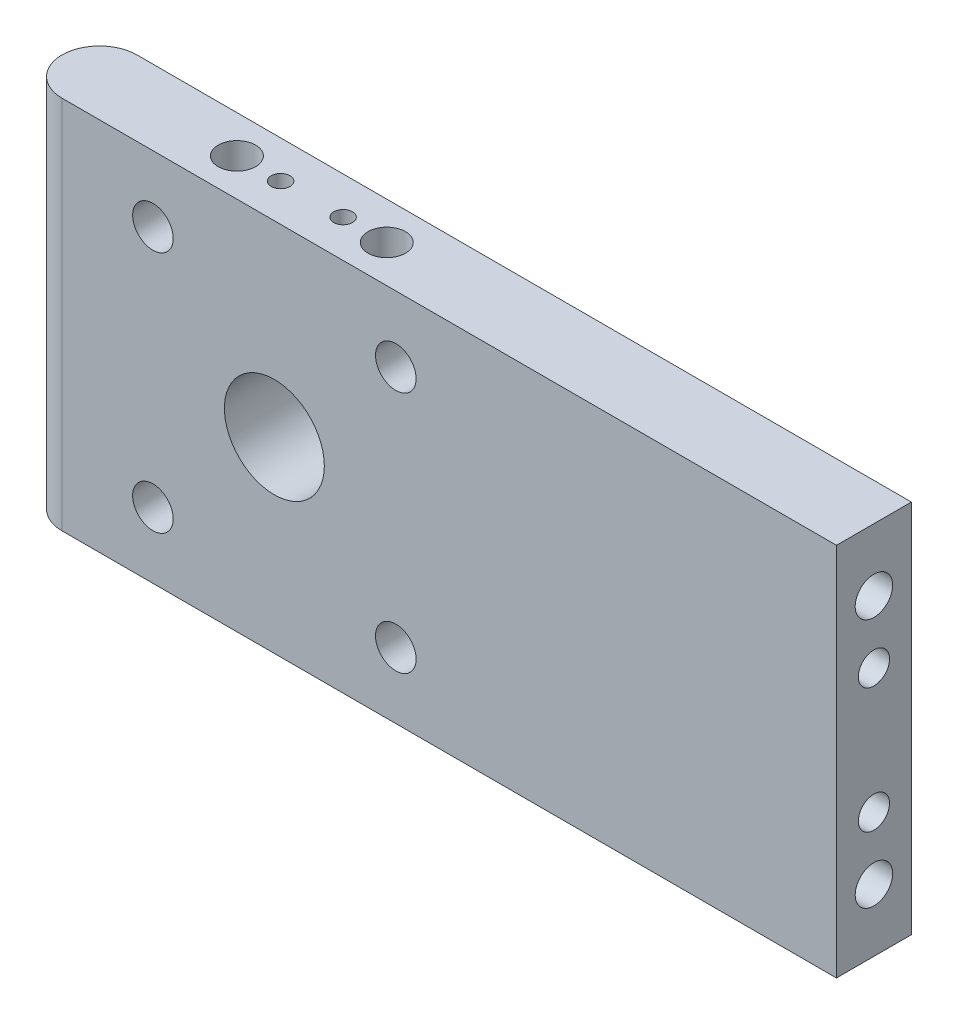
ISO-10303-21;
HEADER;
FILE_DESCRIPTION(('STEP AP214'),'2;1');
FILE_NAME('part.step','',(''),(''),'','','');
FILE_SCHEMA(('AUTOMOTIVE_DESIGN { 1 0 10303 214 1 1 1 1 }'));
ENDSEC;
DATA;
#1=APPLICATION_CONTEXT('core data for automotive mechanical design processes');
#2=APPLICATION_PROTOCOL_DEFINITION('international standard','automotive_design',2000,#1);
#3=PRODUCT_CONTEXT('',#1,'mechanical');
#4=PRODUCT('Part','Part','',(#3));
#5=PRODUCT_RELATED_PRODUCT_CATEGORY('part','',(#4));
#6=PRODUCT_DEFINITION_FORMATION('','',#4);
#7=PRODUCT_DEFINITION_CONTEXT('part definition',#1,'design');
#8=PRODUCT_DEFINITION('design','',#6,#7);
#9=PRODUCT_DEFINITION_SHAPE('','',#8);
#10=(LENGTH_UNIT() NAMED_UNIT(*) SI_UNIT(.MILLI.,.METRE.));
#11=(NAMED_UNIT(*) PLANE_ANGLE_UNIT() SI_UNIT($,.RADIAN.));
#12=(NAMED_UNIT(*) SI_UNIT($,.STERADIAN.) SOLID_ANGLE_UNIT());
#13=UNCERTAINTY_MEASURE_WITH_UNIT(LENGTH_MEASURE(1.E-05),#10,'distance_accuracy_value','');
#14=(GEOMETRIC_REPRESENTATION_CONTEXT(3) GLOBAL_UNCERTAINTY_ASSIGNED_CONTEXT((#13)) GLOBAL_UNIT_ASSIGNED_CONTEXT((#10,
#11,#12)) REPRESENTATION_CONTEXT('',''));
#15=CARTESIAN_POINT('',(0.,0.,0.));
#16=DIRECTION('',(0.,0.,1.));
#17=DIRECTION('',(1.,0.,0.));
#18=AXIS2_PLACEMENT_3D('',#15,#16,#17);
#19=CARTESIAN_POINT('',(0.,0.,12.));
#20=DIRECTION('',(0.,0.,-1.));
#21=DIRECTION('',(-1.,0.,0.));
#22=AXIS2_PLACEMENT_3D('',#19,#20,#21);
#23=PLANE('',#22);
#24=DIRECTION('',(-1.,0.,0.));
#25=VECTOR('',#24,1.);
#26=CARTESIAN_POINT('',(-65.,30.,12.));
#27=LINE('',#26,#25);
#28=CARTESIAN_POINT('',(65.,30.,12.));
#29=VERTEX_POINT('',#28);
#30=CARTESIAN_POINT('',(-59.,30.,12.));
#31=VERTEX_POINT('',#30);
#32=EDGE_CURVE('E75',#29,#31,#27,.T.);
#33=ORIENTED_EDGE('',*,*,#32,.T.);
#34=DIRECTION('',(0.,-1.,0.));
#35=VECTOR('',#34,1.);
#36=CARTESIAN_POINT('',(-59.,0.,12.));
#37=LINE('',#36,#35);
#38=CARTESIAN_POINT('',(-59.,-30.,12.));
#39=VERTEX_POINT('',#38);
#40=EDGE_CURVE('E11',#31,#39,#37,.T.);
#41=ORIENTED_EDGE('',*,*,#40,.T.);
#42=DIRECTION('',(1.,0.,0.));
#43=VECTOR('',#42,1.);
#44=CARTESIAN_POINT('',(-65.,-30.,12.));
#45=LINE('',#44,#43);
#46=CARTESIAN_POINT('',(65.,-30.,12.));
#47=VERTEX_POINT('',#46);
#48=EDGE_CURVE('E83',#39,#47,#45,.T.);
#49=ORIENTED_EDGE('',*,*,#48,.T.);
#50=DIRECTION('',(0.,1.,0.));
#51=VECTOR('',#50,1.);
#52=CARTESIAN_POINT('',(65.,-30.,12.));
#53=LINE('',#52,#51);
#54=EDGE_CURVE('E84',#47,#29,#53,.T.);
#55=ORIENTED_EDGE('',*,*,#54,.T.);
#56=EDGE_LOOP('',(#33,#41,#49,#55));
#57=FACE_BOUND('',#56,.T.);
#58=CARTESIAN_POINT('',(-25.,0.,12.));
#59=DIRECTION('',(0.,0.,1.));
#60=DIRECTION('',(1.,0.,0.));
#61=AXIS2_PLACEMENT_3D('',#58,#59,#60);
#62=CIRCLE('',#61,8.);
#63=CARTESIAN_POINT('',(-17.,0.,12.));
#64=VERTEX_POINT('',#63);
#65=EDGE_CURVE('E119',#64,#64,#62,.T.);
#66=ORIENTED_EDGE('',*,*,#65,.F.);
#67=EDGE_LOOP('',(#66));
#68=FACE_BOUND('',#67,.T.);
#69=CARTESIAN_POINT('',(-5.55456351736992,19.44543648263,12.));
#70=DIRECTION('',(0.,0.,1.));
#71=DIRECTION('',(1.,0.,0.));
#72=AXIS2_PLACEMENT_3D('',#69,#70,#71);
#73=CIRCLE('',#72,3.25);
#74=CARTESIAN_POINT('',(-2.30456351736992,19.44543648263,12.));
#75=VERTEX_POINT('',#74);
#76=EDGE_CURVE('E126',#75,#75,#73,.T.);
#77=ORIENTED_EDGE('',*,*,#76,.F.);
#78=EDGE_LOOP('',(#77));
#79=FACE_BOUND('',#78,.T.);
#80=CARTESIAN_POINT('',(-44.4454364826302,19.44543648263,12.));
#81=DIRECTION('',(0.,0.,1.));
#82=DIRECTION('',(1.,0.,0.));
#83=AXIS2_PLACEMENT_3D('',#80,#81,#82);
#84=CIRCLE('',#83,3.25);
#85=CARTESIAN_POINT('',(-41.1954364826302,19.44543648263,12.));
#86=VERTEX_POINT('',#85);
#87=EDGE_CURVE('E132',#86,#86,#84,.T.);
#88=ORIENTED_EDGE('',*,*,#87,.F.);
#89=EDGE_LOOP('',(#88));
#90=FACE_BOUND('',#89,.T.);
#91=CARTESIAN_POINT('',(-44.4454364826302,-19.4454364826299,12.));
#92=DIRECTION('',(0.,0.,1.));
#93=DIRECTION('',(-1.,0.,0.));
#94=AXIS2_PLACEMENT_3D('',#91,#92,#93);
#95=CIRCLE('',#94,3.25);
#96=CARTESIAN_POINT('',(-47.6954364826302,-19.4454364826299,12.));
#97=VERTEX_POINT('',#96);
#98=EDGE_CURVE('E138',#97,#97,#95,.T.);
#99=ORIENTED_EDGE('',*,*,#98,.F.);
#100=EDGE_LOOP('',(#99));
#101=FACE_BOUND('',#100,.T.);
#102=CARTESIAN_POINT('',(-5.55456351736992,-19.44543648263,12.));
#103=DIRECTION('',(0.,0.,1.));
#104=DIRECTION('',(-1.,0.,0.));
#105=AXIS2_PLACEMENT_3D('',#102,#103,#104);
#106=CIRCLE('',#105,3.25);
#107=CARTESIAN_POINT('',(-8.80456351736992,-19.44543648263,12.));
#108=VERTEX_POINT('',#107);
#109=EDGE_CURVE('E144',#108,#108,#106,.T.);
#110=ORIENTED_EDGE('',*,*,#109,.F.);
#111=EDGE_LOOP('',(#110));
#112=FACE_BOUND('',#111,.T.);
#113=ADVANCED_FACE('F33',(#57,#68,#79,#90,#101,#112),#23,.F.);
#114=CARTESIAN_POINT('',(0.,0.,0.));
#115=DIRECTION('',(0.,0.,-1.));
#116=DIRECTION('',(-1.,0.,0.));
#117=AXIS2_PLACEMENT_3D('',#114,#115,#116);
#118=PLANE('',#117);
#119=CARTESIAN_POINT('',(-44.4454364826302,-19.4454364826299,0.));
#120=DIRECTION('',(0.,0.,1.));
#121=DIRECTION('',(-1.,0.,0.));
#122=AXIS2_PLACEMENT_3D('',#119,#120,#121);
#123=CIRCLE('',#122,3.25);
#124=CARTESIAN_POINT('',(-47.6954364826302,-19.4454364826299,0.));
#125=VERTEX_POINT('',#124);
#126=EDGE_CURVE('E141',#125,#125,#123,.T.);
#127=ORIENTED_EDGE('',*,*,#126,.T.);
#128=EDGE_LOOP('',(#127));
#129=FACE_BOUND('',#128,.T.);
#130=CARTESIAN_POINT('',(-5.55456351736992,19.44543648263,0.));
#131=DIRECTION('',(0.,0.,1.));
#132=DIRECTION('',(1.,0.,0.));
#133=AXIS2_PLACEMENT_3D('',#130,#131,#132);
#134=CIRCLE('',#133,3.25);
#135=CARTESIAN_POINT('',(-2.30456351736992,19.44543648263,0.));
#136=VERTEX_POINT('',#135);
#137=EDGE_CURVE('E129',#136,#136,#134,.T.);
#138=ORIENTED_EDGE('',*,*,#137,.T.);
#139=EDGE_LOOP('',(#138));
#140=FACE_BOUND('',#139,.T.);
#141=DIRECTION('',(1.,0.,0.));
#142=VECTOR('',#141,1.);
#143=CARTESIAN_POINT('',(-65.,-30.,0.));
#144=LINE('',#143,#142);
#145=CARTESIAN_POINT('',(-59.,-30.,0.));
#146=VERTEX_POINT('',#145);
#147=CARTESIAN_POINT('',(65.,-30.,0.));
#148=VERTEX_POINT('',#147);
#149=EDGE_CURVE('E92',#146,#148,#144,.T.);
#150=ORIENTED_EDGE('',*,*,#149,.F.);
#151=DIRECTION('',(0.,-1.,0.));
#152=VECTOR('',#151,1.);
#153=CARTESIAN_POINT('',(-59.,30.,0.));
#154=LINE('',#153,#152);
#155=CARTESIAN_POINT('',(-59.,30.,0.));
#156=VERTEX_POINT('',#155);
#157=EDGE_CURVE('E106',#146,#156,#154,.F.);
#158=ORIENTED_EDGE('',*,*,#157,.T.);
#159=DIRECTION('',(-1.,0.,0.));
#160=VECTOR('',#159,1.);
#161=CARTESIAN_POINT('',(-65.,30.,0.));
#162=LINE('',#161,#160);
#163=CARTESIAN_POINT('',(65.,30.,0.));
#164=VERTEX_POINT('',#163);
#165=EDGE_CURVE('E115',#164,#156,#162,.T.);
#166=ORIENTED_EDGE('',*,*,#165,.F.);
#167=DIRECTION('',(0.,1.,0.));
#168=VECTOR('',#167,1.);
#169=CARTESIAN_POINT('',(65.,-30.,0.));
#170=LINE('',#169,#168);
#171=EDGE_CURVE('E96',#148,#164,#170,.T.);
#172=ORIENTED_EDGE('',*,*,#171,.F.);
#173=EDGE_LOOP('',(#150,#158,#166,#172));
#174=FACE_BOUND('',#173,.T.);
#175=CARTESIAN_POINT('',(-25.,0.,0.));
#176=DIRECTION('',(0.,0.,1.));
#177=DIRECTION('',(1.,0.,0.));
#178=AXIS2_PLACEMENT_3D('',#175,#176,#177);
#179=CIRCLE('',#178,8.);
#180=CARTESIAN_POINT('',(-17.,0.,0.));
#181=VERTEX_POINT('',#180);
#182=EDGE_CURVE('E123',#181,#181,#179,.T.);
#183=ORIENTED_EDGE('',*,*,#182,.T.);
#184=EDGE_LOOP('',(#183));
#185=FACE_BOUND('',#184,.T.);
#186=CARTESIAN_POINT('',(-44.4454364826302,19.44543648263,0.));
#187=DIRECTION('',(0.,0.,1.));
#188=DIRECTION('',(1.,0.,0.));
#189=AXIS2_PLACEMENT_3D('',#186,#187,#188);
#190=CIRCLE('',#189,3.25);
#191=CARTESIAN_POINT('',(-41.1954364826302,19.44543648263,0.));
#192=VERTEX_POINT('',#191);
#193=EDGE_CURVE('E135',#192,#192,#190,.T.);
#194=ORIENTED_EDGE('',*,*,#193,.T.);
#195=EDGE_LOOP('',(#194));
#196=FACE_BOUND('',#195,.T.);
#197=CARTESIAN_POINT('',(-5.55456351736992,-19.44543648263,0.));
#198=DIRECTION('',(0.,0.,1.));
#199=DIRECTION('',(-1.,0.,0.));
#200=AXIS2_PLACEMENT_3D('',#197,#198,#199);
#201=CIRCLE('',#200,3.25);
#202=CARTESIAN_POINT('',(-8.80456351736992,-19.44543648263,0.));
#203=VERTEX_POINT('',#202);
#204=EDGE_CURVE('E147',#203,#203,#201,.T.);
#205=ORIENTED_EDGE('',*,*,#204,.T.);
#206=EDGE_LOOP('',(#205));
#207=FACE_BOUND('',#206,.T.);
#208=ADVANCED_FACE('F113',(#129,#140,#174,#185,#196,#207),#118,.T.);
#209=CARTESIAN_POINT('',(65.,-30.,12.));
#210=DIRECTION('',(-1.,0.,0.));
#211=DIRECTION('',(0.,0.,1.));
#212=AXIS2_PLACEMENT_3D('',#209,#210,#211);
#213=PLANE('',#212);
#214=CARTESIAN_POINT('',(65.,20.,6.));
#215=DIRECTION('',(1.,0.,0.));
#216=DIRECTION('',(0.,0.,-1.));
#217=AXIS2_PLACEMENT_3D('',#214,#215,#216);
#218=CIRCLE('',#217,3.);
#219=CARTESIAN_POINT('',(65.,20.,3.));
#220=VERTEX_POINT('',#219);
#221=EDGE_CURVE('E171',#220,#220,#218,.T.);
#222=ORIENTED_EDGE('',*,*,#221,.F.);
#223=EDGE_LOOP('',(#222));
#224=FACE_BOUND('',#223,.T.);
#225=CARTESIAN_POINT('',(65.,10.,6.));
#226=DIRECTION('',(1.,0.,0.));
#227=DIRECTION('',(0.,0.,-1.));
#228=AXIS2_PLACEMENT_3D('',#225,#226,#227);
#229=CIRCLE('',#228,2.5);
#230=CARTESIAN_POINT('',(65.,10.,3.5));
#231=VERTEX_POINT('',#230);
#232=EDGE_CURVE('E165',#231,#231,#229,.T.);
#233=ORIENTED_EDGE('',*,*,#232,.F.);
#234=EDGE_LOOP('',(#233));
#235=FACE_BOUND('',#234,.T.);
#236=CARTESIAN_POINT('',(65.,-10.,6.));
#237=DIRECTION('',(1.,0.,0.));
#238=DIRECTION('',(0.,0.,1.));
#239=AXIS2_PLACEMENT_3D('',#236,#237,#238);
#240=CIRCLE('',#239,2.5);
#241=CARTESIAN_POINT('',(65.,-10.,8.5));
#242=VERTEX_POINT('',#241);
#243=EDGE_CURVE('E159',#242,#242,#240,.T.);
#244=ORIENTED_EDGE('',*,*,#243,.F.);
#245=EDGE_LOOP('',(#244));
#246=FACE_BOUND('',#245,.T.);
#247=CARTESIAN_POINT('',(65.,-20.,6.));
#248=DIRECTION('',(1.,0.,0.));
#249=DIRECTION('',(0.,0.,1.));
#250=AXIS2_PLACEMENT_3D('',#247,#248,#249);
#251=CIRCLE('',#250,3.);
#252=CARTESIAN_POINT('',(65.,-20.,9.));
#253=VERTEX_POINT('',#252);
#254=EDGE_CURVE('E152',#253,#253,#251,.T.);
#255=ORIENTED_EDGE('',*,*,#254,.F.);
#256=EDGE_LOOP('',(#255));
#257=FACE_BOUND('',#256,.T.);
#258=ORIENTED_EDGE('',*,*,#171,.T.);
#259=DIRECTION('',(0.,0.,-1.));
#260=VECTOR('',#259,1.);
#261=CARTESIAN_POINT('',(65.,30.,12.));
#262=LINE('',#261,#260);
#263=EDGE_CURVE('E79',#29,#164,#262,.T.);
#264=ORIENTED_EDGE('',*,*,#263,.F.);
#265=ORIENTED_EDGE('',*,*,#54,.F.);
#266=DIRECTION('',(0.,0.,-1.));
#267=VECTOR('',#266,1.);
#268=CARTESIAN_POINT('',(65.,-30.,12.));
#269=LINE('',#268,#267);
#270=EDGE_CURVE('E98',#47,#148,#269,.T.);
#271=ORIENTED_EDGE('',*,*,#270,.T.);
#272=EDGE_LOOP('',(#258,#264,#265,#271));
#273=FACE_BOUND('',#272,.T.);
#274=ADVANCED_FACE('F94',(#224,#235,#246,#257,#273),#213,.F.);
#275=CARTESIAN_POINT('',(-65.,30.,12.));
#276=DIRECTION('',(0.,-1.,0.));
#277=DIRECTION('',(0.,0.,-1.));
#278=AXIS2_PLACEMENT_3D('',#275,#276,#277);
#279=PLANE('',#278);
#280=CARTESIAN_POINT('',(-13.,30.,6.));
#281=DIRECTION('',(0.,1.,0.));
#282=DIRECTION('',(0.,0.,1.));
#283=AXIS2_PLACEMENT_3D('',#280,#281,#282);
#284=CIRCLE('',#283,3.);
#285=CARTESIAN_POINT('',(-13.,30.,9.));
#286=VERTEX_POINT('',#285);
#287=EDGE_CURVE('E195',#286,#286,#284,.T.);
#288=ORIENTED_EDGE('',*,*,#287,.F.);
#289=EDGE_LOOP('',(#288));
#290=FACE_BOUND('',#289,.T.);
#291=CARTESIAN_POINT('',(-20.,30.,6.));
#292=DIRECTION('',(0.,1.,0.));
#293=DIRECTION('',(0.,0.,1.));
#294=AXIS2_PLACEMENT_3D('',#291,#292,#293);
#295=CIRCLE('',#294,1.5);
#296=CARTESIAN_POINT('',(-20.,30.,7.5));
#297=VERTEX_POINT('',#296);
#298=EDGE_CURVE('E189',#297,#297,#295,.T.);
#299=ORIENTED_EDGE('',*,*,#298,.F.);
#300=EDGE_LOOP('',(#299));
#301=FACE_BOUND('',#300,.T.);
#302=CARTESIAN_POINT('',(-30.,30.,6.));
#303=DIRECTION('',(0.,1.,0.));
#304=DIRECTION('',(0.,0.,-1.));
#305=AXIS2_PLACEMENT_3D('',#302,#303,#304);
#306=CIRCLE('',#305,1.5);
#307=CARTESIAN_POINT('',(-30.,30.,4.5));
#308=VERTEX_POINT('',#307);
#309=EDGE_CURVE('E183',#308,#308,#306,.T.);
#310=ORIENTED_EDGE('',*,*,#309,.F.);
#311=EDGE_LOOP('',(#310));
#312=FACE_BOUND('',#311,.T.);
#313=CARTESIAN_POINT('',(-37.,30.,6.));
#314=DIRECTION('',(0.,1.,0.));
#315=DIRECTION('',(0.,0.,-1.));
#316=AXIS2_PLACEMENT_3D('',#313,#314,#315);
#317=CIRCLE('',#316,3.);
#318=CARTESIAN_POINT('',(-37.,30.,3.));
#319=VERTEX_POINT('',#318);
#320=EDGE_CURVE('E177',#319,#319,#317,.T.);
#321=ORIENTED_EDGE('',*,*,#320,.F.);
#322=EDGE_LOOP('',(#321));
#323=FACE_BOUND('',#322,.T.);
#324=ORIENTED_EDGE('',*,*,#165,.T.);
#325=CARTESIAN_POINT('',(-59.,30.,6.));
#326=DIRECTION('',(0.,-1.,0.));
#327=DIRECTION('',(0.,0.,-1.));
#328=AXIS2_PLACEMENT_3D('',#325,#326,#327);
#329=CIRCLE('',#328,6.);
#330=CARTESIAN_POINT('',(-65.,30.,6.));
#331=VERTEX_POINT('',#330);
#332=EDGE_CURVE('E42',#156,#331,#329,.F.);
#333=ORIENTED_EDGE('',*,*,#332,.T.);
#334=CARTESIAN_POINT('',(-59.,30.,6.));
#335=DIRECTION('',(0.,-1.,0.));
#336=DIRECTION('',(0.,0.,-1.));
#337=AXIS2_PLACEMENT_3D('',#334,#335,#336);
#338=CIRCLE('',#337,6.);
#339=EDGE_CURVE('E49',#331,#31,#338,.F.);
#340=ORIENTED_EDGE('',*,*,#339,.T.);
#341=ORIENTED_EDGE('',*,*,#32,.F.);
#342=ORIENTED_EDGE('',*,*,#263,.T.);
#343=EDGE_LOOP('',(#324,#333,#340,#341,#342));
#344=FACE_BOUND('',#343,.T.);
#345=ADVANCED_FACE('F77',(#290,#301,#312,#323,#344),#279,.F.);
#346=CARTESIAN_POINT('',(-65.,-30.,12.));
#347=DIRECTION('',(0.,1.,0.));
#348=DIRECTION('',(0.,0.,1.));
#349=AXIS2_PLACEMENT_3D('',#346,#347,#348);
#350=PLANE('',#349);
#351=CARTESIAN_POINT('',(-59.,-30.,6.));
#352=DIRECTION('',(0.,1.,0.));
#353=DIRECTION('',(0.,0.,1.));
#354=AXIS2_PLACEMENT_3D('',#351,#352,#353);
#355=CIRCLE('',#354,6.);
#356=CARTESIAN_POINT('',(-65.,-30.,6.));
#357=VERTEX_POINT('',#356);
#358=EDGE_CURVE('E97',#39,#357,#355,.F.);
#359=ORIENTED_EDGE('',*,*,#358,.T.);
#360=CARTESIAN_POINT('',(-59.,-30.,6.));
#361=DIRECTION('',(0.,1.,0.));
#362=DIRECTION('',(0.,0.,1.));
#363=AXIS2_PLACEMENT_3D('',#360,#361,#362);
#364=CIRCLE('',#363,6.);
#365=EDGE_CURVE('E100',#357,#146,#364,.F.);
#366=ORIENTED_EDGE('',*,*,#365,.T.);
#367=ORIENTED_EDGE('',*,*,#149,.T.);
#368=ORIENTED_EDGE('',*,*,#270,.F.);
#369=ORIENTED_EDGE('',*,*,#48,.F.);
#370=EDGE_LOOP('',(#359,#366,#367,#368,#369));
#371=FACE_BOUND('',#370,.T.);
#372=ADVANCED_FACE('F212',(#371),#350,.F.);
#373=CARTESIAN_POINT('',(-25.,0.,12.));
#374=DIRECTION('',(0.,0.,-1.));
#375=DIRECTION('',(-1.,0.,0.));
#376=AXIS2_PLACEMENT_3D('',#373,#374,#375);
#377=CYLINDRICAL_SURFACE('',#376,8.);
#378=ORIENTED_EDGE('',*,*,#65,.T.);
#379=EDGE_LOOP('',(#378));
#380=FACE_BOUND('',#379,.T.);
#381=ORIENTED_EDGE('',*,*,#182,.F.);
#382=EDGE_LOOP('',(#381));
#383=FACE_BOUND('',#382,.T.);
#384=ADVANCED_FACE('F245',(#380,#383),#377,.F.);
#385=CARTESIAN_POINT('',(-5.55456351736992,19.44543648263,12.));
#386=DIRECTION('',(0.,0.,-1.));
#387=DIRECTION('',(-1.,0.,0.));
#388=AXIS2_PLACEMENT_3D('',#385,#386,#387);
#389=CYLINDRICAL_SURFACE('',#388,3.25);
#390=ORIENTED_EDGE('',*,*,#76,.T.);
#391=EDGE_LOOP('',(#390));
#392=FACE_BOUND('',#391,.T.);
#393=ORIENTED_EDGE('',*,*,#137,.F.);
#394=EDGE_LOOP('',(#393));
#395=FACE_BOUND('',#394,.T.);
#396=ADVANCED_FACE('F284',(#392,#395),#389,.F.);
#397=CARTESIAN_POINT('',(-44.4454364826302,19.44543648263,12.));
#398=DIRECTION('',(0.,0.,-1.));
#399=DIRECTION('',(-1.,0.,0.));
#400=AXIS2_PLACEMENT_3D('',#397,#398,#399);
#401=CYLINDRICAL_SURFACE('',#400,3.25);
#402=ORIENTED_EDGE('',*,*,#87,.T.);
#403=EDGE_LOOP('',(#402));
#404=FACE_BOUND('',#403,.T.);
#405=ORIENTED_EDGE('',*,*,#193,.F.);
#406=EDGE_LOOP('',(#405));
#407=FACE_BOUND('',#406,.T.);
#408=ADVANCED_FACE('F277',(#404,#407),#401,.F.);
#409=CARTESIAN_POINT('',(-44.4454364826302,-19.4454364826299,12.));
#410=DIRECTION('',(0.,0.,-1.));
#411=DIRECTION('',(-1.,0.,0.));
#412=AXIS2_PLACEMENT_3D('',#409,#410,#411);
#413=CYLINDRICAL_SURFACE('',#412,3.25);
#414=ORIENTED_EDGE('',*,*,#98,.T.);
#415=EDGE_LOOP('',(#414));
#416=FACE_BOUND('',#415,.T.);
#417=ORIENTED_EDGE('',*,*,#126,.F.);
#418=EDGE_LOOP('',(#417));
#419=FACE_BOUND('',#418,.T.);
#420=ADVANCED_FACE('F271',(#416,#419),#413,.F.);
#421=CARTESIAN_POINT('',(-5.55456351736992,-19.44543648263,12.));
#422=DIRECTION('',(0.,0.,-1.));
#423=DIRECTION('',(-1.,0.,0.));
#424=AXIS2_PLACEMENT_3D('',#421,#422,#423);
#425=CYLINDRICAL_SURFACE('',#424,3.25);
#426=ORIENTED_EDGE('',*,*,#109,.T.);
#427=EDGE_LOOP('',(#426));
#428=FACE_BOUND('',#427,.T.);
#429=ORIENTED_EDGE('',*,*,#204,.F.);
#430=EDGE_LOOP('',(#429));
#431=FACE_BOUND('',#430,.T.);
#432=ADVANCED_FACE('F263',(#428,#431),#425,.F.);
#433=CARTESIAN_POINT('',(-59.,0.,6.));
#434=DIRECTION('',(0.,-1.,0.));
#435=DIRECTION('',(0.,0.,-1.));
#436=AXIS2_PLACEMENT_3D('',#433,#434,#435);
#437=CYLINDRICAL_SURFACE('',#436,6.);
#438=ORIENTED_EDGE('',*,*,#40,.F.);
#439=ORIENTED_EDGE('',*,*,#339,.F.);
#440=DIRECTION('',(0.,-1.,0.));
#441=VECTOR('',#440,1.);
#442=CARTESIAN_POINT('',(-65.,-30.,6.));
#443=LINE('',#442,#441);
#444=EDGE_CURVE('E37',#357,#331,#443,.F.);
#445=ORIENTED_EDGE('',*,*,#444,.F.);
#446=ORIENTED_EDGE('',*,*,#358,.F.);
#447=EDGE_LOOP('',(#438,#439,#445,#446));
#448=FACE_BOUND('',#447,.T.);
#449=ADVANCED_FACE('F35',(#448),#437,.T.);
#450=CARTESIAN_POINT('',(-59.,-30.,6.));
#451=DIRECTION('',(0.,1.,0.));
#452=DIRECTION('',(0.,0.,1.));
#453=AXIS2_PLACEMENT_3D('',#450,#451,#452);
#454=CYLINDRICAL_SURFACE('',#453,6.);
#455=ORIENTED_EDGE('',*,*,#332,.F.);
#456=ORIENTED_EDGE('',*,*,#157,.F.);
#457=ORIENTED_EDGE('',*,*,#365,.F.);
#458=ORIENTED_EDGE('',*,*,#444,.T.);
#459=EDGE_LOOP('',(#455,#456,#457,#458));
#460=FACE_BOUND('',#459,.T.);
#461=ADVANCED_FACE('F253',(#460),#454,.T.);
#462=CARTESIAN_POINT('',(45.,-20.,6.));
#463=DIRECTION('',(1.,0.,0.));
#464=DIRECTION('',(0.,0.,-1.));
#465=AXIS2_PLACEMENT_3D('',#462,#463,#464);
#466=CYLINDRICAL_SURFACE('',#465,3.);
#467=CARTESIAN_POINT('',(45.,-20.,6.));
#468=DIRECTION('',(1.,0.,0.));
#469=DIRECTION('',(0.,0.,1.));
#470=AXIS2_PLACEMENT_3D('',#467,#468,#469);
#471=CIRCLE('',#470,3.);
#472=CARTESIAN_POINT('',(45.,-20.,9.));
#473=VERTEX_POINT('',#472);
#474=EDGE_CURVE('E155',#473,#473,#471,.T.);
#475=ORIENTED_EDGE('',*,*,#474,.F.);
#476=EDGE_LOOP('',(#475));
#477=FACE_BOUND('',#476,.T.);
#478=ORIENTED_EDGE('',*,*,#254,.T.);
#479=EDGE_LOOP('',(#478));
#480=FACE_BOUND('',#479,.T.);
#481=ADVANCED_FACE('F255',(#477,#480),#466,.F.);
#482=CARTESIAN_POINT('',(45.,-20.,6.));
#483=DIRECTION('',(-1.,0.,0.));
#484=DIRECTION('',(0.,0.,1.));
#485=AXIS2_PLACEMENT_3D('',#482,#483,#484);
#486=PLANE('',#485);
#487=ORIENTED_EDGE('',*,*,#474,.T.);
#488=EDGE_LOOP('',(#487));
#489=FACE_BOUND('',#488,.T.);
#490=ADVANCED_FACE('F260',(#489),#486,.F.);
#491=CARTESIAN_POINT('',(45.,-10.,6.));
#492=DIRECTION('',(1.,0.,0.));
#493=DIRECTION('',(0.,0.,-1.));
#494=AXIS2_PLACEMENT_3D('',#491,#492,#493);
#495=CYLINDRICAL_SURFACE('',#494,2.5);
#496=CARTESIAN_POINT('',(45.,-10.,6.));
#497=DIRECTION('',(1.,0.,0.));
#498=DIRECTION('',(0.,0.,1.));
#499=AXIS2_PLACEMENT_3D('',#496,#497,#498);
#500=CIRCLE('',#499,2.5);
#501=CARTESIAN_POINT('',(45.,-10.,8.5));
#502=VERTEX_POINT('',#501);
#503=EDGE_CURVE('E162',#502,#502,#500,.T.);
#504=ORIENTED_EDGE('',*,*,#503,.F.);
#505=EDGE_LOOP('',(#504));
#506=FACE_BOUND('',#505,.T.);
#507=ORIENTED_EDGE('',*,*,#243,.T.);
#508=EDGE_LOOP('',(#507));
#509=FACE_BOUND('',#508,.T.);
#510=ADVANCED_FACE('F387',(#506,#509),#495,.F.);
#511=CARTESIAN_POINT('',(45.,-10.,6.));
#512=DIRECTION('',(-1.,0.,0.));
#513=DIRECTION('',(0.,0.,1.));
#514=AXIS2_PLACEMENT_3D('',#511,#512,#513);
#515=PLANE('',#514);
#516=ORIENTED_EDGE('',*,*,#503,.T.);
#517=EDGE_LOOP('',(#516));
#518=FACE_BOUND('',#517,.T.);
#519=ADVANCED_FACE('F395',(#518),#515,.F.);
#520=CARTESIAN_POINT('',(45.,10.,6.));
#521=DIRECTION('',(1.,0.,0.));
#522=DIRECTION('',(0.,0.,-1.));
#523=AXIS2_PLACEMENT_3D('',#520,#521,#522);
#524=CYLINDRICAL_SURFACE('',#523,2.5);
#525=CARTESIAN_POINT('',(45.,10.,6.));
#526=DIRECTION('',(1.,0.,0.));
#527=DIRECTION('',(0.,0.,-1.));
#528=AXIS2_PLACEMENT_3D('',#525,#526,#527);
#529=CIRCLE('',#528,2.5);
#530=CARTESIAN_POINT('',(45.,10.,3.5));
#531=VERTEX_POINT('',#530);
#532=EDGE_CURVE('E168',#531,#531,#529,.T.);
#533=ORIENTED_EDGE('',*,*,#532,.F.);
#534=EDGE_LOOP('',(#533));
#535=FACE_BOUND('',#534,.T.);
#536=ORIENTED_EDGE('',*,*,#232,.T.);
#537=EDGE_LOOP('',(#536));
#538=FACE_BOUND('',#537,.T.);
#539=ADVANCED_FACE('F404',(#535,#538),#524,.F.);
#540=CARTESIAN_POINT('',(45.,10.,6.));
#541=DIRECTION('',(1.,0.,0.));
#542=DIRECTION('',(0.,0.,-1.));
#543=AXIS2_PLACEMENT_3D('',#540,#541,#542);
#544=PLANE('',#543);
#545=ORIENTED_EDGE('',*,*,#532,.T.);
#546=EDGE_LOOP('',(#545));
#547=FACE_BOUND('',#546,.T.);
#548=ADVANCED_FACE('F413',(#547),#544,.T.);
#549=CARTESIAN_POINT('',(45.,20.,6.));
#550=DIRECTION('',(1.,0.,0.));
#551=DIRECTION('',(0.,0.,-1.));
#552=AXIS2_PLACEMENT_3D('',#549,#550,#551);
#553=CYLINDRICAL_SURFACE('',#552,3.);
#554=CARTESIAN_POINT('',(45.,20.,6.));
#555=DIRECTION('',(1.,0.,0.));
#556=DIRECTION('',(0.,0.,-1.));
#557=AXIS2_PLACEMENT_3D('',#554,#555,#556);
#558=CIRCLE('',#557,3.);
#559=CARTESIAN_POINT('',(45.,20.,3.));
#560=VERTEX_POINT('',#559);
#561=EDGE_CURVE('E174',#560,#560,#558,.T.);
#562=ORIENTED_EDGE('',*,*,#561,.F.);
#563=EDGE_LOOP('',(#562));
#564=FACE_BOUND('',#563,.T.);
#565=ORIENTED_EDGE('',*,*,#221,.T.);
#566=EDGE_LOOP('',(#565));
#567=FACE_BOUND('',#566,.T.);
#568=ADVANCED_FACE('F233',(#564,#567),#553,.F.);
#569=CARTESIAN_POINT('',(45.,20.,6.));
#570=DIRECTION('',(1.,0.,0.));
#571=DIRECTION('',(0.,0.,-1.));
#572=AXIS2_PLACEMENT_3D('',#569,#570,#571);
#573=PLANE('',#572);
#574=ORIENTED_EDGE('',*,*,#561,.T.);
#575=EDGE_LOOP('',(#574));
#576=FACE_BOUND('',#575,.T.);
#577=ADVANCED_FACE('F223',(#576),#573,.T.);
#578=CARTESIAN_POINT('',(-37.,15.,6.));
#579=DIRECTION('',(0.,1.,0.));
#580=DIRECTION('',(0.,0.,1.));
#581=AXIS2_PLACEMENT_3D('',#578,#579,#580);
#582=CYLINDRICAL_SURFACE('',#581,3.);
#583=CARTESIAN_POINT('',(-37.,15.,6.));
#584=DIRECTION('',(0.,1.,0.));
#585=DIRECTION('',(0.,0.,-1.));
#586=AXIS2_PLACEMENT_3D('',#583,#584,#585);
#587=CIRCLE('',#586,3.);
#588=CARTESIAN_POINT('',(-37.,15.,3.));
#589=VERTEX_POINT('',#588);
#590=EDGE_CURVE('E180',#589,#589,#587,.T.);
#591=ORIENTED_EDGE('',*,*,#590,.F.);
#592=EDGE_LOOP('',(#591));
#593=FACE_BOUND('',#592,.T.);
#594=ORIENTED_EDGE('',*,*,#320,.T.);
#595=EDGE_LOOP('',(#594));
#596=FACE_BOUND('',#595,.T.);
#597=ADVANCED_FACE('F220',(#593,#596),#582,.F.);
#598=CARTESIAN_POINT('',(-37.,15.,6.));
#599=DIRECTION('',(0.,-1.,0.));
#600=DIRECTION('',(0.,0.,-1.));
#601=AXIS2_PLACEMENT_3D('',#598,#599,#600);
#602=PLANE('',#601);
#603=ORIENTED_EDGE('',*,*,#590,.T.);
#604=EDGE_LOOP('',(#603));
#605=FACE_BOUND('',#604,.T.);
#606=ADVANCED_FACE('F222',(#605),#602,.F.);
#607=CARTESIAN_POINT('',(-30.,15.,6.));
#608=DIRECTION('',(0.,1.,0.));
#609=DIRECTION('',(0.,0.,1.));
#610=AXIS2_PLACEMENT_3D('',#607,#608,#609);
#611=CYLINDRICAL_SURFACE('',#610,1.5);
#612=CARTESIAN_POINT('',(-30.,15.,6.));
#613=DIRECTION('',(0.,1.,0.));
#614=DIRECTION('',(0.,0.,-1.));
#615=AXIS2_PLACEMENT_3D('',#612,#613,#614);
#616=CIRCLE('',#615,1.5);
#617=CARTESIAN_POINT('',(-30.,15.,4.5));
#618=VERTEX_POINT('',#617);
#619=EDGE_CURVE('E186',#618,#618,#616,.T.);
#620=ORIENTED_EDGE('',*,*,#619,.F.);
#621=EDGE_LOOP('',(#620));
#622=FACE_BOUND('',#621,.T.);
#623=ORIENTED_EDGE('',*,*,#309,.T.);
#624=EDGE_LOOP('',(#623));
#625=FACE_BOUND('',#624,.T.);
#626=ADVANCED_FACE('F230',(#622,#625),#611,.F.);
#627=CARTESIAN_POINT('',(-30.,15.,6.));
#628=DIRECTION('',(0.,-1.,0.));
#629=DIRECTION('',(0.,0.,-1.));
#630=AXIS2_PLACEMENT_3D('',#627,#628,#629);
#631=PLANE('',#630);
#632=ORIENTED_EDGE('',*,*,#619,.T.);
#633=EDGE_LOOP('',(#632));
#634=FACE_BOUND('',#633,.T.);
#635=ADVANCED_FACE('F451',(#634),#631,.F.);
#636=CARTESIAN_POINT('',(-20.,15.,6.));
#637=DIRECTION('',(0.,1.,0.));
#638=DIRECTION('',(0.,0.,1.));
#639=AXIS2_PLACEMENT_3D('',#636,#637,#638);
#640=CYLINDRICAL_SURFACE('',#639,1.5);
#641=CARTESIAN_POINT('',(-20.,15.,6.));
#642=DIRECTION('',(0.,1.,0.));
#643=DIRECTION('',(0.,0.,1.));
#644=AXIS2_PLACEMENT_3D('',#641,#642,#643);
#645=CIRCLE('',#644,1.5);
#646=CARTESIAN_POINT('',(-20.,15.,7.5));
#647=VERTEX_POINT('',#646);
#648=EDGE_CURVE('E192',#647,#647,#645,.T.);
#649=ORIENTED_EDGE('',*,*,#648,.F.);
#650=EDGE_LOOP('',(#649));
#651=FACE_BOUND('',#650,.T.);
#652=ORIENTED_EDGE('',*,*,#298,.T.);
#653=EDGE_LOOP('',(#652));
#654=FACE_BOUND('',#653,.T.);
#655=ADVANCED_FACE('F460',(#651,#654),#640,.F.);
#656=CARTESIAN_POINT('',(-20.,15.,6.));
#657=DIRECTION('',(0.,1.,0.));
#658=DIRECTION('',(0.,0.,1.));
#659=AXIS2_PLACEMENT_3D('',#656,#657,#658);
#660=PLANE('',#659);
#661=ORIENTED_EDGE('',*,*,#648,.T.);
#662=EDGE_LOOP('',(#661));
#663=FACE_BOUND('',#662,.T.);
#664=ADVANCED_FACE('F206',(#663),#660,.T.);
#665=CARTESIAN_POINT('',(-13.,15.,6.));
#666=DIRECTION('',(0.,1.,0.));
#667=DIRECTION('',(0.,0.,1.));
#668=AXIS2_PLACEMENT_3D('',#665,#666,#667);
#669=CYLINDRICAL_SURFACE('',#668,3.);
#670=CARTESIAN_POINT('',(-13.,15.,6.));
#671=DIRECTION('',(0.,1.,0.));
#672=DIRECTION('',(0.,0.,1.));
#673=AXIS2_PLACEMENT_3D('',#670,#671,#672);
#674=CIRCLE('',#673,3.);
#675=CARTESIAN_POINT('',(-13.,15.,9.));
#676=VERTEX_POINT('',#675);
#677=EDGE_CURVE('E156',#676,#676,#674,.T.);
#678=ORIENTED_EDGE('',*,*,#677,.F.);
#679=EDGE_LOOP('',(#678));
#680=FACE_BOUND('',#679,.T.);
#681=ORIENTED_EDGE('',*,*,#287,.T.);
#682=EDGE_LOOP('',(#681));
#683=FACE_BOUND('',#682,.T.);
#684=ADVANCED_FACE('F203',(#680,#683),#669,.F.);
#685=CARTESIAN_POINT('',(-13.,15.,6.));
#686=DIRECTION('',(0.,1.,0.));
#687=DIRECTION('',(0.,0.,1.));
#688=AXIS2_PLACEMENT_3D('',#685,#686,#687);
#689=PLANE('',#688);
#690=ORIENTED_EDGE('',*,*,#677,.T.);
#691=EDGE_LOOP('',(#690));
#692=FACE_BOUND('',#691,.T.);
#693=ADVANCED_FACE('F201',(#692),#689,.T.);
#694=CLOSED_SHELL('',(#113,#208,#274,#345,#372,#384,#396,#408,#420,#432,#449,#461,#481,#490,
#510,#519,#539,#548,#568,#577,#597,#606,#626,#635,#655,#664,#684,#693));
#695=MANIFOLD_SOLID_BREP('B2',#694);
#696=ADVANCED_BREP_SHAPE_REPRESENTATION('',(#18,#695),#14);
#697=SHAPE_DEFINITION_REPRESENTATION(#9,#696);
ENDSEC;
END-ISO-10303-21;
